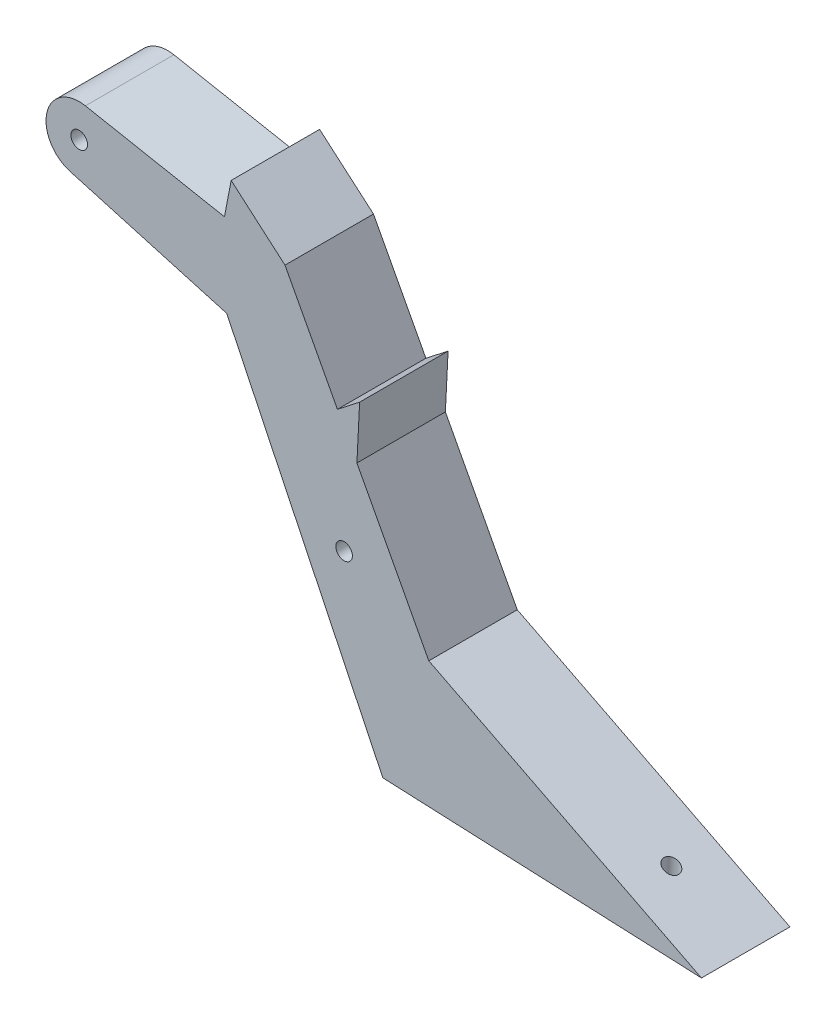
ISO-10303-21;
HEADER;
FILE_DESCRIPTION(('STEP AP214'),'2;1');
FILE_NAME('part.step','',(''),(''),'','','');
FILE_SCHEMA(('AUTOMOTIVE_DESIGN { 1 0 10303 214 1 1 1 1 }'));
ENDSEC;
DATA;
#1=APPLICATION_CONTEXT('core data for automotive mechanical design processes');
#2=APPLICATION_PROTOCOL_DEFINITION('international standard','automotive_design',2000,#1);
#3=PRODUCT_CONTEXT('',#1,'mechanical');
#4=PRODUCT('Part','Part','',(#3));
#5=PRODUCT_RELATED_PRODUCT_CATEGORY('part','',(#4));
#6=PRODUCT_DEFINITION_FORMATION('','',#4);
#7=PRODUCT_DEFINITION_CONTEXT('part definition',#1,'design');
#8=PRODUCT_DEFINITION('design','',#6,#7);
#9=PRODUCT_DEFINITION_SHAPE('','',#8);
#10=(LENGTH_UNIT() NAMED_UNIT(*) SI_UNIT(.MILLI.,.METRE.));
#11=(NAMED_UNIT(*) PLANE_ANGLE_UNIT() SI_UNIT($,.RADIAN.));
#12=(NAMED_UNIT(*) SI_UNIT($,.STERADIAN.) SOLID_ANGLE_UNIT());
#13=UNCERTAINTY_MEASURE_WITH_UNIT(LENGTH_MEASURE(1.E-05),#10,'distance_accuracy_value','');
#14=(GEOMETRIC_REPRESENTATION_CONTEXT(3) GLOBAL_UNCERTAINTY_ASSIGNED_CONTEXT((#13)) GLOBAL_UNIT_ASSIGNED_CONTEXT((#10,
#11,#12)) REPRESENTATION_CONTEXT('',''));
#15=CARTESIAN_POINT('',(0.,0.,0.));
#16=DIRECTION('',(0.,0.,1.));
#17=DIRECTION('',(1.,0.,0.));
#18=AXIS2_PLACEMENT_3D('',#15,#16,#17);
#19=CARTESIAN_POINT('',(37.2209746860255,-1.00537022475931,16.));
#20=DIRECTION('',(-0.883195821558928,-0.469004414457743,0.));
#21=DIRECTION('',(0.469004414457743,-0.883195821558928,0.));
#22=AXIS2_PLACEMENT_3D('',#19,#20,#21);
#23=PLANE('',#22);
#24=DIRECTION('',(-0.469004414457743,0.883195821558928,0.));
#25=VECTOR('',#24,1.);
#26=CARTESIAN_POINT('',(37.2209746860255,-1.00537022475931,16.));
#27=LINE('',#26,#25);
#28=CARTESIAN_POINT('',(46.6985747444453,-18.852913898055,16.));
#29=VERTEX_POINT('',#28);
#30=CARTESIAN_POINT('',(37.2209746860255,-1.00537022475931,16.));
#31=VERTEX_POINT('',#30);
#32=EDGE_CURVE('E245',#29,#31,#27,.T.);
#33=ORIENTED_EDGE('',*,*,#32,.F.);
#34=DIRECTION('',(0.,0.,1.));
#35=VECTOR('',#34,1.);
#36=CARTESIAN_POINT('',(46.6985747444453,-18.8529138980549,0.));
#37=LINE('',#36,#35);
#38=CARTESIAN_POINT('',(46.6985747444453,-18.8529138980549,0.));
#39=VERTEX_POINT('',#38);
#40=EDGE_CURVE('E281',#39,#29,#37,.T.);
#41=ORIENTED_EDGE('',*,*,#40,.F.);
#42=DIRECTION('',(-0.469004414457743,0.883195821558928,0.));
#43=VECTOR('',#42,1.);
#44=CARTESIAN_POINT('',(37.2209746860255,-1.00537022475931,0.));
#45=LINE('',#44,#43);
#46=CARTESIAN_POINT('',(37.2209746860255,-1.00537022475931,0.));
#47=VERTEX_POINT('',#46);
#48=EDGE_CURVE('E162',#39,#47,#45,.T.);
#49=ORIENTED_EDGE('',*,*,#48,.T.);
#50=DIRECTION('',(0.,0.,-1.));
#51=VECTOR('',#50,1.);
#52=CARTESIAN_POINT('',(37.2209746860255,-1.00537022475931,16.));
#53=LINE('',#52,#51);
#54=EDGE_CURVE('E184',#31,#47,#53,.T.);
#55=ORIENTED_EDGE('',*,*,#54,.F.);
#56=EDGE_LOOP('',(#33,#41,#49,#55));
#57=FACE_BOUND('',#56,.T.);
#58=ADVANCED_FACE('F44',(#57),#23,.F.);
#59=CARTESIAN_POINT('',(0.,0.,16.));
#60=DIRECTION('',(0.,0.,1.));
#61=DIRECTION('',(1.,0.,0.));
#62=AXIS2_PLACEMENT_3D('',#59,#60,#61);
#63=PLANE('',#62);
#64=CARTESIAN_POINT('',(47.9111175536976,-40.4615263218011,16.));
#65=DIRECTION('',(0.,0.,1.));
#66=DIRECTION('',(1.,0.,0.));
#67=AXIS2_PLACEMENT_3D('',#64,#65,#66);
#68=CIRCLE('',#67,1.5);
#69=CARTESIAN_POINT('',(49.4111175536976,-40.4615263218011,16.));
#70=VERTEX_POINT('',#69);
#71=EDGE_CURVE('E205',#70,#70,#68,.T.);
#72=ORIENTED_EDGE('',*,*,#71,.F.);
#73=EDGE_LOOP('',(#72));
#74=FACE_BOUND('',#73,.T.);
#75=DIRECTION('',(-0.433829895516032,0.900994795632333,0.));
#76=VECTOR('',#75,1.);
#77=CARTESIAN_POINT('',(26.6827335987823,-13.8357209188859,16.));
#78=LINE('',#77,#76);
#79=CARTESIAN_POINT('',(54.9111175536976,-72.4615263218011,16.));
#80=VERTEX_POINT('',#79);
#81=CARTESIAN_POINT('',(26.6827335987823,-13.8357209188859,16.));
#82=VERTEX_POINT('',#81);
#83=EDGE_CURVE('E211',#80,#82,#78,.T.);
#84=ORIENTED_EDGE('',*,*,#83,.F.);
#85=DIRECTION('',(0.999031203229182,-0.0440074422621161,0.));
#86=VECTOR('',#85,1.);
#87=CARTESIAN_POINT('',(112.538061605381,-75.,16.));
#88=LINE('',#87,#86);
#89=CARTESIAN_POINT('',(112.538061605381,-75.,16.));
#90=VERTEX_POINT('',#89);
#91=EDGE_CURVE('E174',#80,#90,#88,.T.);
#92=ORIENTED_EDGE('',*,*,#91,.T.);
#93=DIRECTION('',(-0.891770927429079,0.452487141245228,0.));
#94=VECTOR('',#93,1.);
#95=CARTESIAN_POINT('',(63.2279842048484,-49.979924472451,16.));
#96=LINE('',#95,#94);
#97=CARTESIAN_POINT('',(63.2279842048484,-49.979924472451,16.));
#98=VERTEX_POINT('',#97);
#99=EDGE_CURVE('E243',#90,#98,#96,.T.);
#100=ORIENTED_EDGE('',*,*,#99,.T.);
#101=CARTESIAN_POINT('',(50.2244794454369,-25.4926473486051,16.));
#102=VERTEX_POINT('',#101);
#103=EDGE_CURVE('E246',#98,#102,#27,.T.);
#104=ORIENTED_EDGE('',*,*,#103,.T.);
#105=DIRECTION('',(0.049916707520047,0.998753384129615,0.));
#106=VECTOR('',#105,1.);
#107=CARTESIAN_POINT('',(50.7127196250252,-15.7237431908936,16.));
#108=LINE('',#107,#106);
#109=CARTESIAN_POINT('',(50.7127196250252,-15.7237431908936,16.));
#110=VERTEX_POINT('',#109);
#111=EDGE_CURVE('E141',#102,#110,#108,.T.);
#112=ORIENTED_EDGE('',*,*,#111,.T.);
#113=DIRECTION('',(-0.788679715737918,-0.614804282665269,0.));
#114=VECTOR('',#113,1.);
#115=CARTESIAN_POINT('',(46.6985747444453,-18.8529138980549,16.));
#116=LINE('',#115,#114);
#117=EDGE_CURVE('E60',#110,#29,#116,.T.);
#118=ORIENTED_EDGE('',*,*,#117,.T.);
#119=ORIENTED_EDGE('',*,*,#32,.T.);
#120=DIRECTION('',(0.75751334061122,-0.652819683217372,0.));
#121=VECTOR('',#120,1.);
#122=CARTESIAN_POINT('',(37.2209746860255,-1.00537022475931,16.));
#123=LINE('',#122,#121);
#124=CARTESIAN_POINT('',(27.4801375180719,7.38921491762844,16.));
#125=VERTEX_POINT('',#124);
#126=EDGE_CURVE('E195',#125,#31,#123,.T.);
#127=ORIENTED_EDGE('',*,*,#126,.F.);
#128=DIRECTION('',(0.187730049160435,0.982220661889283,0.));
#129=VECTOR('',#128,1.);
#130=CARTESIAN_POINT('',(27.4801375180719,7.38921491762844,16.));
#131=LINE('',#130,#129);
#132=CARTESIAN_POINT('',(26.2755325268767,1.08661223330399,16.));
#133=VERTEX_POINT('',#132);
#134=EDGE_CURVE('E201',#133,#125,#131,.T.);
#135=ORIENTED_EDGE('',*,*,#134,.F.);
#136=DIRECTION('',(-0.982220661889283,0.187730049160435,0.));
#137=VECTOR('',#136,1.);
#138=CARTESIAN_POINT('',(1.12638029496261,5.8933239713357,16.));
#139=LINE('',#138,#137);
#140=CARTESIAN_POINT('',(1.12638029496261,5.8933239713357,16.));
#141=VERTEX_POINT('',#140);
#142=EDGE_CURVE('E68',#133,#141,#139,.T.);
#143=ORIENTED_EDGE('',*,*,#142,.T.);
#144=CARTESIAN_POINT('',(0.,0.,16.));
#145=DIRECTION('',(0.,0.,1.));
#146=DIRECTION('',(1.,0.,0.));
#147=AXIS2_PLACEMENT_3D('',#144,#145,#146);
#148=CIRCLE('',#147,6.);
#149=CARTESIAN_POINT('',(-1.6430506475302,-5.77064853977875,16.));
#150=VERTEX_POINT('',#149);
#151=EDGE_CURVE('E249',#141,#150,#148,.T.);
#152=ORIENTED_EDGE('',*,*,#151,.T.);
#153=DIRECTION('',(0.961774756629791,-0.273841774588366,0.));
#154=VECTOR('',#153,1.);
#155=CARTESIAN_POINT('',(26.6827335987823,-13.8357209188859,16.));
#156=LINE('',#155,#154);
#157=EDGE_CURVE('E178',#150,#82,#156,.T.);
#158=ORIENTED_EDGE('',*,*,#157,.T.);
#159=EDGE_LOOP('',(#84,#92,#100,#104,#112,#118,#119,#127,#135,#143,#152,#158));
#160=FACE_BOUND('',#159,.T.);
#161=CARTESIAN_POINT('',(0.,0.,16.));
#162=DIRECTION('',(0.,0.,1.));
#163=DIRECTION('',(1.,0.,0.));
#164=AXIS2_PLACEMENT_3D('',#161,#162,#163);
#165=CIRCLE('',#164,1.5);
#166=CARTESIAN_POINT('',(1.5,0.,16.));
#167=VERTEX_POINT('',#166);
#168=EDGE_CURVE('E236',#167,#167,#165,.T.);
#169=ORIENTED_EDGE('',*,*,#168,.F.);
#170=EDGE_LOOP('',(#169));
#171=FACE_BOUND('',#170,.T.);
#172=ADVANCED_FACE('F274',(#74,#160,#171),#63,.T.);
#173=CARTESIAN_POINT('',(0.,0.,0.));
#174=DIRECTION('',(0.,0.,1.));
#175=DIRECTION('',(1.,0.,0.));
#176=AXIS2_PLACEMENT_3D('',#173,#174,#175);
#177=PLANE('',#176);
#178=CARTESIAN_POINT('',(47.9111175536976,-40.4615263218011,0.));
#179=DIRECTION('',(0.,0.,-1.));
#180=DIRECTION('',(-1.,0.,0.));
#181=AXIS2_PLACEMENT_3D('',#178,#179,#180);
#182=CIRCLE('',#181,1.5);
#183=CARTESIAN_POINT('',(46.4111175536976,-40.4615263218011,0.));
#184=VERTEX_POINT('',#183);
#185=EDGE_CURVE('E279',#184,#184,#182,.T.);
#186=ORIENTED_EDGE('',*,*,#185,.F.);
#187=EDGE_LOOP('',(#186));
#188=FACE_BOUND('',#187,.T.);
#189=DIRECTION('',(0.999031203229182,-0.0440074422621161,0.));
#190=VECTOR('',#189,1.);
#191=CARTESIAN_POINT('',(112.538061605381,-75.,0.));
#192=LINE('',#191,#190);
#193=CARTESIAN_POINT('',(54.9111175536976,-72.4615263218011,0.));
#194=VERTEX_POINT('',#193);
#195=CARTESIAN_POINT('',(112.538061605381,-75.,0.));
#196=VERTEX_POINT('',#195);
#197=EDGE_CURVE('E239',#194,#196,#192,.T.);
#198=ORIENTED_EDGE('',*,*,#197,.F.);
#199=DIRECTION('',(-0.433829895516032,0.900994795632333,0.));
#200=VECTOR('',#199,1.);
#201=CARTESIAN_POINT('',(16.2527340455594,7.82570770332413,0.));
#202=LINE('',#201,#200);
#203=CARTESIAN_POINT('',(26.6827335987823,-13.8357209188859,0.));
#204=VERTEX_POINT('',#203);
#205=EDGE_CURVE('E217',#194,#204,#202,.T.);
#206=ORIENTED_EDGE('',*,*,#205,.T.);
#207=DIRECTION('',(0.961774756629791,-0.273841774588366,0.));
#208=VECTOR('',#207,1.);
#209=CARTESIAN_POINT('',(26.6827335987823,-13.8357209188859,0.));
#210=LINE('',#209,#208);
#211=CARTESIAN_POINT('',(-1.6430506475302,-5.77064853977875,0.));
#212=VERTEX_POINT('',#211);
#213=EDGE_CURVE('E171',#212,#204,#210,.T.);
#214=ORIENTED_EDGE('',*,*,#213,.F.);
#215=CARTESIAN_POINT('',(0.,0.,0.));
#216=DIRECTION('',(0.,0.,1.));
#217=DIRECTION('',(1.,0.,0.));
#218=AXIS2_PLACEMENT_3D('',#215,#216,#217);
#219=CIRCLE('',#218,6.);
#220=CARTESIAN_POINT('',(1.12638029496261,5.8933239713357,0.));
#221=VERTEX_POINT('',#220);
#222=EDGE_CURVE('E164',#221,#212,#219,.T.);
#223=ORIENTED_EDGE('',*,*,#222,.F.);
#224=DIRECTION('',(-0.982220661889283,0.187730049160435,0.));
#225=VECTOR('',#224,1.);
#226=CARTESIAN_POINT('',(1.12638029496261,5.8933239713357,0.));
#227=LINE('',#226,#225);
#228=CARTESIAN_POINT('',(26.2755325268767,1.08661223330399,0.));
#229=VERTEX_POINT('',#228);
#230=EDGE_CURVE('E161',#229,#221,#227,.T.);
#231=ORIENTED_EDGE('',*,*,#230,.F.);
#232=DIRECTION('',(0.187730049160435,0.982220661889283,0.));
#233=VECTOR('',#232,1.);
#234=CARTESIAN_POINT('',(27.4801375180719,7.38921491762844,0.));
#235=LINE('',#234,#233);
#236=CARTESIAN_POINT('',(27.4801375180719,7.38921491762844,0.));
#237=VERTEX_POINT('',#236);
#238=EDGE_CURVE('E200',#229,#237,#235,.T.);
#239=ORIENTED_EDGE('',*,*,#238,.T.);
#240=DIRECTION('',(0.75751334061122,-0.652819683217372,0.));
#241=VECTOR('',#240,1.);
#242=CARTESIAN_POINT('',(37.2209746860255,-1.00537022475931,0.));
#243=LINE('',#242,#241);
#244=EDGE_CURVE('E193',#237,#47,#243,.T.);
#245=ORIENTED_EDGE('',*,*,#244,.T.);
#246=ORIENTED_EDGE('',*,*,#48,.F.);
#247=DIRECTION('',(-0.788679715737918,-0.614804282665269,0.));
#248=VECTOR('',#247,1.);
#249=CARTESIAN_POINT('',(46.6985747444453,-18.8529138980549,0.));
#250=LINE('',#249,#248);
#251=CARTESIAN_POINT('',(50.7127196250252,-15.7237431908936,0.));
#252=VERTEX_POINT('',#251);
#253=EDGE_CURVE('E147',#252,#39,#250,.T.);
#254=ORIENTED_EDGE('',*,*,#253,.F.);
#255=DIRECTION('',(0.049916707520047,0.998753384129615,0.));
#256=VECTOR('',#255,1.);
#257=CARTESIAN_POINT('',(50.7127196250252,-15.7237431908936,0.));
#258=LINE('',#257,#256);
#259=CARTESIAN_POINT('',(50.2244794454369,-25.4926473486051,0.));
#260=VERTEX_POINT('',#259);
#261=EDGE_CURVE('E139',#260,#252,#258,.T.);
#262=ORIENTED_EDGE('',*,*,#261,.F.);
#263=CARTESIAN_POINT('',(63.2279842048484,-49.979924472451,0.));
#264=VERTEX_POINT('',#263);
#265=EDGE_CURVE('E155',#264,#260,#45,.T.);
#266=ORIENTED_EDGE('',*,*,#265,.F.);
#267=DIRECTION('',(-0.891770927429079,0.452487141245228,0.));
#268=VECTOR('',#267,1.);
#269=CARTESIAN_POINT('',(63.2279842048484,-49.979924472451,0.));
#270=LINE('',#269,#268);
#271=EDGE_CURVE('E166',#196,#264,#270,.T.);
#272=ORIENTED_EDGE('',*,*,#271,.F.);
#273=EDGE_LOOP('',(#198,#206,#214,#223,#231,#239,#245,#246,#254,#262,#266,#272));
#274=FACE_BOUND('',#273,.T.);
#275=CARTESIAN_POINT('',(0.,0.,0.));
#276=DIRECTION('',(0.,0.,1.));
#277=DIRECTION('',(1.,0.,0.));
#278=AXIS2_PLACEMENT_3D('',#275,#276,#277);
#279=CIRCLE('',#278,1.5);
#280=CARTESIAN_POINT('',(1.5,0.,0.));
#281=VERTEX_POINT('',#280);
#282=EDGE_CURVE('E232',#281,#281,#279,.T.);
#283=ORIENTED_EDGE('',*,*,#282,.T.);
#284=EDGE_LOOP('',(#283));
#285=FACE_BOUND('',#284,.T.);
#286=ADVANCED_FACE('F152',(#188,#274,#285),#177,.F.);
#287=CARTESIAN_POINT('',(112.538061605381,-75.,16.));
#288=DIRECTION('',(0.0440074422621161,0.999031203229182,0.));
#289=DIRECTION('',(-0.999031203229182,0.0440074422621161,0.));
#290=AXIS2_PLACEMENT_3D('',#287,#288,#289);
#291=PLANE('',#290);
#292=CARTESIAN_POINT('',(98.8217695266379,-74.3957957171363,8.));
#293=DIRECTION('',(-0.0440074422621161,-0.999031203229182,0.));
#294=DIRECTION('',(0.999031203229182,-0.0440074422621161,0.));
#295=AXIS2_PLACEMENT_3D('',#292,#293,#294);
#296=CIRCLE('',#295,1.35000000000001);
#297=CARTESIAN_POINT('',(100.170461650997,-74.4552057641901,8.));
#298=VERTEX_POINT('',#297);
#299=EDGE_CURVE('E221',#298,#298,#296,.T.);
#300=ORIENTED_EDGE('',*,*,#299,.F.);
#301=EDGE_LOOP('',(#300));
#302=FACE_BOUND('',#301,.T.);
#303=CARTESIAN_POINT('',(80.8392078685126,-73.6036617564182,8.));
#304=DIRECTION('',(-0.0440074422621161,-0.999031203229182,0.));
#305=DIRECTION('',(0.999031203229182,-0.0440074422621161,0.));
#306=AXIS2_PLACEMENT_3D('',#303,#304,#305);
#307=CIRCLE('',#306,1.35000000000001);
#308=CARTESIAN_POINT('',(82.1878999928721,-73.6630718034721,8.));
#309=VERTEX_POINT('',#308);
#310=EDGE_CURVE('E220',#309,#309,#307,.T.);
#311=ORIENTED_EDGE('',*,*,#310,.F.);
#312=EDGE_LOOP('',(#311));
#313=FACE_BOUND('',#312,.T.);
#314=CARTESIAN_POINT('',(62.8566462103874,-72.8115277957001,8.));
#315=DIRECTION('',(-0.0440074422621161,-0.999031203229182,0.));
#316=DIRECTION('',(0.999031203229182,-0.0440074422621161,0.));
#317=AXIS2_PLACEMENT_3D('',#314,#315,#316);
#318=CIRCLE('',#317,1.35000000000001);
#319=CARTESIAN_POINT('',(64.2053383347468,-72.870937842754,8.));
#320=VERTEX_POINT('',#319);
#321=EDGE_CURVE('E233',#320,#320,#318,.T.);
#322=ORIENTED_EDGE('',*,*,#321,.F.);
#323=EDGE_LOOP('',(#322));
#324=FACE_BOUND('',#323,.T.);
#325=ORIENTED_EDGE('',*,*,#91,.F.);
#326=DIRECTION('',(0.,0.,1.));
#327=VECTOR('',#326,1.);
#328=CARTESIAN_POINT('',(54.9111175536976,-72.4615263218011,-17.));
#329=LINE('',#328,#327);
#330=EDGE_CURVE('E215',#194,#80,#329,.T.);
#331=ORIENTED_EDGE('',*,*,#330,.F.);
#332=ORIENTED_EDGE('',*,*,#197,.T.);
#333=DIRECTION('',(0.,0.,-1.));
#334=VECTOR('',#333,1.);
#335=CARTESIAN_POINT('',(112.538061605381,-75.,16.));
#336=LINE('',#335,#334);
#337=EDGE_CURVE('E13',#90,#196,#336,.T.);
#338=ORIENTED_EDGE('',*,*,#337,.F.);
#339=EDGE_LOOP('',(#325,#331,#332,#338));
#340=FACE_BOUND('',#339,.T.);
#341=ADVANCED_FACE('F46',(#302,#313,#324,#340),#291,.F.);
#342=CARTESIAN_POINT('',(63.2279842048484,-49.979924472451,16.));
#343=DIRECTION('',(-0.452487141245229,-0.89177092742908,0.));
#344=DIRECTION('',(0.891770927429079,-0.452487141245228,0.));
#345=AXIS2_PLACEMENT_3D('',#342,#343,#344);
#346=PLANE('',#345);
#347=CARTESIAN_POINT('',(99.0956086321407,-68.1792605812789,8.));
#348=DIRECTION('',(-0.452487141245229,-0.89177092742908,0.));
#349=DIRECTION('',(0.891770927429079,-0.452487141245228,0.));
#350=AXIS2_PLACEMENT_3D('',#347,#348,#349);
#351=ELLIPSE('',#350,1.48218124282779,1.35000000000001);
#352=CARTESIAN_POINT('',(100.417374773675,-68.8499285346534,8.));
#353=VERTEX_POINT('',#352);
#354=EDGE_CURVE('E48',#353,#353,#351,.T.);
#355=ORIENTED_EDGE('',*,*,#354,.T.);
#356=EDGE_LOOP('',(#355));
#357=FACE_BOUND('',#356,.T.);
#358=ORIENTED_EDGE('',*,*,#271,.T.);
#359=DIRECTION('',(0.,0.,-1.));
#360=VECTOR('',#359,1.);
#361=CARTESIAN_POINT('',(63.2279842048484,-49.979924472451,16.));
#362=LINE('',#361,#360);
#363=EDGE_CURVE('E53',#98,#264,#362,.T.);
#364=ORIENTED_EDGE('',*,*,#363,.F.);
#365=ORIENTED_EDGE('',*,*,#99,.F.);
#366=ORIENTED_EDGE('',*,*,#337,.T.);
#367=EDGE_LOOP('',(#358,#364,#365,#366));
#368=FACE_BOUND('',#367,.T.);
#369=ADVANCED_FACE('F256',(#357,#368),#346,.F.);
#370=ORIENTED_EDGE('',*,*,#265,.T.);
#371=DIRECTION('',(0.,0.,1.));
#372=VECTOR('',#371,1.);
#373=CARTESIAN_POINT('',(50.2244794454369,-25.4926473486051,0.));
#374=LINE('',#373,#372);
#375=EDGE_CURVE('E136',#260,#102,#374,.T.);
#376=ORIENTED_EDGE('',*,*,#375,.T.);
#377=ORIENTED_EDGE('',*,*,#103,.F.);
#378=ORIENTED_EDGE('',*,*,#363,.T.);
#379=EDGE_LOOP('',(#370,#376,#377,#378));
#380=FACE_BOUND('',#379,.T.);
#381=ADVANCED_FACE('F159',(#380),#23,.F.);
#382=CARTESIAN_POINT('',(1.12638029496261,5.8933239713357,16.));
#383=DIRECTION('',(-0.187730049160435,-0.982220661889283,0.));
#384=DIRECTION('',(0.982220661889283,-0.187730049160435,0.));
#385=AXIS2_PLACEMENT_3D('',#382,#383,#384);
#386=PLANE('',#385);
#387=ORIENTED_EDGE('',*,*,#142,.F.);
#388=DIRECTION('',(0.,0.,-1.));
#389=VECTOR('',#388,1.);
#390=CARTESIAN_POINT('',(26.2755325268767,1.08661223330399,16.));
#391=LINE('',#390,#389);
#392=EDGE_CURVE('E212',#133,#229,#391,.T.);
#393=ORIENTED_EDGE('',*,*,#392,.T.);
#394=ORIENTED_EDGE('',*,*,#230,.T.);
#395=DIRECTION('',(0.,0.,-1.));
#396=VECTOR('',#395,1.);
#397=CARTESIAN_POINT('',(1.12638029496261,5.8933239713357,16.));
#398=LINE('',#397,#396);
#399=EDGE_CURVE('E181',#141,#221,#398,.T.);
#400=ORIENTED_EDGE('',*,*,#399,.F.);
#401=EDGE_LOOP('',(#387,#393,#394,#400));
#402=FACE_BOUND('',#401,.T.);
#403=ADVANCED_FACE('F269',(#402),#386,.F.);
#404=CARTESIAN_POINT('',(0.,0.,16.));
#405=DIRECTION('',(0.,0.,-1.));
#406=DIRECTION('',(-1.,0.,0.));
#407=AXIS2_PLACEMENT_3D('',#404,#405,#406);
#408=CYLINDRICAL_SURFACE('',#407,6.);
#409=ORIENTED_EDGE('',*,*,#222,.T.);
#410=DIRECTION('',(0.,0.,-1.));
#411=VECTOR('',#410,1.);
#412=CARTESIAN_POINT('',(-1.6430506475302,-5.77064853977875,16.));
#413=LINE('',#412,#411);
#414=EDGE_CURVE('E177',#150,#212,#413,.T.);
#415=ORIENTED_EDGE('',*,*,#414,.F.);
#416=ORIENTED_EDGE('',*,*,#151,.F.);
#417=ORIENTED_EDGE('',*,*,#399,.T.);
#418=EDGE_LOOP('',(#409,#415,#416,#417));
#419=FACE_BOUND('',#418,.T.);
#420=ADVANCED_FACE('F268',(#419),#408,.T.);
#421=CARTESIAN_POINT('',(26.6827335987823,-13.8357209188859,16.));
#422=DIRECTION('',(0.273841774588366,0.961774756629791,0.));
#423=DIRECTION('',(-0.961774756629791,0.273841774588366,0.));
#424=AXIS2_PLACEMENT_3D('',#421,#422,#423);
#425=PLANE('',#424);
#426=ORIENTED_EDGE('',*,*,#213,.T.);
#427=DIRECTION('',(0.,0.,-1.));
#428=VECTOR('',#427,1.);
#429=CARTESIAN_POINT('',(26.6827335987823,-13.8357209188859,16.));
#430=LINE('',#429,#428);
#431=EDGE_CURVE('E175',#82,#204,#430,.T.);
#432=ORIENTED_EDGE('',*,*,#431,.F.);
#433=ORIENTED_EDGE('',*,*,#157,.F.);
#434=ORIENTED_EDGE('',*,*,#414,.T.);
#435=EDGE_LOOP('',(#426,#432,#433,#434));
#436=FACE_BOUND('',#435,.T.);
#437=ADVANCED_FACE('F263',(#436),#425,.F.);
#438=CARTESIAN_POINT('',(0.,0.,16.));
#439=DIRECTION('',(0.,0.,-1.));
#440=DIRECTION('',(-1.,0.,0.));
#441=AXIS2_PLACEMENT_3D('',#438,#439,#440);
#442=CYLINDRICAL_SURFACE('',#441,1.5);
#443=ORIENTED_EDGE('',*,*,#168,.T.);
#444=EDGE_LOOP('',(#443));
#445=FACE_BOUND('',#444,.T.);
#446=ORIENTED_EDGE('',*,*,#282,.F.);
#447=EDGE_LOOP('',(#446));
#448=FACE_BOUND('',#447,.T.);
#449=ADVANCED_FACE('F340',(#445,#448),#442,.F.);
#450=CARTESIAN_POINT('',(63.2967206330085,-62.8212157634083,8.));
#451=DIRECTION('',(-0.0440074422621161,-0.999031203229182,0.));
#452=DIRECTION('',(0.999031203229182,-0.0440074422621161,0.));
#453=AXIS2_PLACEMENT_3D('',#450,#451,#452);
#454=CYLINDRICAL_SURFACE('',#453,1.35000000000001);
#455=CARTESIAN_POINT('',(63.2967206330085,-62.8212157634083,8.));
#456=DIRECTION('',(-0.0440074422621161,-0.999031203229182,0.));
#457=DIRECTION('',(0.999031203229182,-0.0440074422621161,0.));
#458=AXIS2_PLACEMENT_3D('',#455,#456,#457);
#459=CIRCLE('',#458,1.35000000000001);
#460=CARTESIAN_POINT('',(64.6454127573679,-62.8806258104621,8.));
#461=VERTEX_POINT('',#460);
#462=EDGE_CURVE('E229',#461,#461,#459,.T.);
#463=ORIENTED_EDGE('',*,*,#462,.F.);
#464=EDGE_LOOP('',(#463));
#465=FACE_BOUND('',#464,.T.);
#466=ORIENTED_EDGE('',*,*,#321,.T.);
#467=EDGE_LOOP('',(#466));
#468=FACE_BOUND('',#467,.T.);
#469=ADVANCED_FACE('F328',(#465,#468),#454,.F.);
#470=CARTESIAN_POINT('',(63.2967206330085,-62.8212157634083,8.));
#471=DIRECTION('',(-0.0440074422621161,-0.999031203229182,0.));
#472=DIRECTION('',(0.999031203229182,-0.0440074422621161,0.));
#473=AXIS2_PLACEMENT_3D('',#470,#471,#472);
#474=PLANE('',#473);
#475=ORIENTED_EDGE('',*,*,#462,.T.);
#476=EDGE_LOOP('',(#475));
#477=FACE_BOUND('',#476,.T.);
#478=ADVANCED_FACE('F318',(#477),#474,.T.);
#479=CARTESIAN_POINT('',(99.2618439492591,-64.4054836848445,8.));
#480=DIRECTION('',(-0.0440074422621161,-0.999031203229182,0.));
#481=DIRECTION('',(0.999031203229182,-0.0440074422621161,0.));
#482=AXIS2_PLACEMENT_3D('',#479,#480,#481);
#483=CYLINDRICAL_SURFACE('',#482,1.35000000000001);
#484=ORIENTED_EDGE('',*,*,#299,.T.);
#485=EDGE_LOOP('',(#484));
#486=FACE_BOUND('',#485,.T.);
#487=ORIENTED_EDGE('',*,*,#354,.F.);
#488=EDGE_LOOP('',(#487));
#489=FACE_BOUND('',#488,.T.);
#490=ADVANCED_FACE('F315',(#486,#489),#483,.F.);
#491=CARTESIAN_POINT('',(81.2792822911338,-63.6133497241264,8.));
#492=DIRECTION('',(-0.0440074422621161,-0.999031203229182,0.));
#493=DIRECTION('',(0.999031203229182,-0.0440074422621161,0.));
#494=AXIS2_PLACEMENT_3D('',#491,#492,#493);
#495=CYLINDRICAL_SURFACE('',#494,1.35000000000001);
#496=CARTESIAN_POINT('',(81.2792822911338,-63.6133497241264,8.));
#497=DIRECTION('',(-0.0440074422621161,-0.999031203229182,0.));
#498=DIRECTION('',(0.999031203229182,-0.0440074422621161,0.));
#499=AXIS2_PLACEMENT_3D('',#496,#497,#498);
#500=CIRCLE('',#499,1.35000000000001);
#501=CARTESIAN_POINT('',(82.6279744154932,-63.6727597711802,8.));
#502=VERTEX_POINT('',#501);
#503=EDGE_CURVE('E224',#502,#502,#500,.T.);
#504=ORIENTED_EDGE('',*,*,#503,.F.);
#505=EDGE_LOOP('',(#504));
#506=FACE_BOUND('',#505,.T.);
#507=ORIENTED_EDGE('',*,*,#310,.T.);
#508=EDGE_LOOP('',(#507));
#509=FACE_BOUND('',#508,.T.);
#510=ADVANCED_FACE('F317',(#506,#509),#495,.F.);
#511=CARTESIAN_POINT('',(81.2792822911338,-63.6133497241264,8.));
#512=DIRECTION('',(-0.0440074422621161,-0.999031203229182,0.));
#513=DIRECTION('',(0.999031203229182,-0.0440074422621161,0.));
#514=AXIS2_PLACEMENT_3D('',#511,#512,#513);
#515=PLANE('',#514);
#516=ORIENTED_EDGE('',*,*,#503,.T.);
#517=EDGE_LOOP('',(#516));
#518=FACE_BOUND('',#517,.T.);
#519=ADVANCED_FACE('F325',(#518),#515,.T.);
#520=CARTESIAN_POINT('',(26.6827335987823,-13.8357209188859,-17.));
#521=DIRECTION('',(0.900994795632333,0.433829895516032,0.));
#522=DIRECTION('',(-0.433829895516032,0.900994795632333,0.));
#523=AXIS2_PLACEMENT_3D('',#520,#521,#522);
#524=PLANE('',#523);
#525=ORIENTED_EDGE('',*,*,#330,.T.);
#526=ORIENTED_EDGE('',*,*,#83,.T.);
#527=ORIENTED_EDGE('',*,*,#431,.T.);
#528=ORIENTED_EDGE('',*,*,#205,.F.);
#529=EDGE_LOOP('',(#525,#526,#527,#528));
#530=FACE_BOUND('',#529,.T.);
#531=ADVANCED_FACE('F333',(#530),#524,.F.);
#532=CARTESIAN_POINT('',(37.2209746860255,-1.00537022475931,16.));
#533=DIRECTION('',(0.652819683217372,0.75751334061122,0.));
#534=DIRECTION('',(-0.75751334061122,0.652819683217372,0.));
#535=AXIS2_PLACEMENT_3D('',#532,#533,#534);
#536=PLANE('',#535);
#537=ORIENTED_EDGE('',*,*,#244,.F.);
#538=DIRECTION('',(0.,0.,-1.));
#539=VECTOR('',#538,1.);
#540=CARTESIAN_POINT('',(27.4801375180719,7.38921491762844,16.));
#541=LINE('',#540,#539);
#542=EDGE_CURVE('E209',#125,#237,#541,.T.);
#543=ORIENTED_EDGE('',*,*,#542,.F.);
#544=ORIENTED_EDGE('',*,*,#126,.T.);
#545=ORIENTED_EDGE('',*,*,#54,.T.);
#546=EDGE_LOOP('',(#537,#543,#544,#545));
#547=FACE_BOUND('',#546,.T.);
#548=ADVANCED_FACE('F192',(#547),#536,.T.);
#549=CARTESIAN_POINT('',(27.4801375180719,7.38921491762844,16.));
#550=DIRECTION('',(-0.982220661889283,0.187730049160435,0.));
#551=DIRECTION('',(-0.187730049160435,-0.982220661889283,0.));
#552=AXIS2_PLACEMENT_3D('',#549,#550,#551);
#553=PLANE('',#552);
#554=ORIENTED_EDGE('',*,*,#238,.F.);
#555=ORIENTED_EDGE('',*,*,#392,.F.);
#556=ORIENTED_EDGE('',*,*,#134,.T.);
#557=ORIENTED_EDGE('',*,*,#542,.T.);
#558=EDGE_LOOP('',(#554,#555,#556,#557));
#559=FACE_BOUND('',#558,.T.);
#560=ADVANCED_FACE('F272',(#559),#553,.T.);
#561=CARTESIAN_POINT('',(47.9111175536976,-40.4615263218011,48.));
#562=DIRECTION('',(0.,0.,-1.));
#563=DIRECTION('',(-1.,0.,0.));
#564=AXIS2_PLACEMENT_3D('',#561,#562,#563);
#565=CYLINDRICAL_SURFACE('',#564,1.5);
#566=ORIENTED_EDGE('',*,*,#71,.T.);
#567=EDGE_LOOP('',(#566));
#568=FACE_BOUND('',#567,.T.);
#569=ORIENTED_EDGE('',*,*,#185,.T.);
#570=EDGE_LOOP('',(#569));
#571=FACE_BOUND('',#570,.T.);
#572=ADVANCED_FACE('F438',(#568,#571),#565,.F.);
#573=CARTESIAN_POINT('',(46.6985747444453,-18.8529138980549,0.));
#574=DIRECTION('',(-0.614804282665269,0.788679715737918,0.));
#575=DIRECTION('',(-0.788679715737918,-0.614804282665269,0.));
#576=AXIS2_PLACEMENT_3D('',#573,#574,#575);
#577=PLANE('',#576);
#578=ORIENTED_EDGE('',*,*,#117,.F.);
#579=DIRECTION('',(0.,0.,1.));
#580=VECTOR('',#579,1.);
#581=CARTESIAN_POINT('',(50.7127196250252,-15.7237431908936,0.));
#582=LINE('',#581,#580);
#583=EDGE_CURVE('E146',#252,#110,#582,.T.);
#584=ORIENTED_EDGE('',*,*,#583,.F.);
#585=ORIENTED_EDGE('',*,*,#253,.T.);
#586=ORIENTED_EDGE('',*,*,#40,.T.);
#587=EDGE_LOOP('',(#578,#584,#585,#586));
#588=FACE_BOUND('',#587,.T.);
#589=ADVANCED_FACE('F289',(#588),#577,.T.);
#590=CARTESIAN_POINT('',(50.7127196250252,-15.7237431908936,0.));
#591=DIRECTION('',(0.998753384129615,-0.049916707520047,0.));
#592=DIRECTION('',(0.049916707520047,0.998753384129615,0.));
#593=AXIS2_PLACEMENT_3D('',#590,#591,#592);
#594=PLANE('',#593);
#595=ORIENTED_EDGE('',*,*,#111,.F.);
#596=ORIENTED_EDGE('',*,*,#375,.F.);
#597=ORIENTED_EDGE('',*,*,#261,.T.);
#598=ORIENTED_EDGE('',*,*,#583,.T.);
#599=EDGE_LOOP('',(#595,#596,#597,#598));
#600=FACE_BOUND('',#599,.T.);
#601=ADVANCED_FACE('F138',(#600),#594,.T.);
#602=CLOSED_SHELL('',(#58,#172,#286,#341,#369,#381,#403,#420,#437,#449,#469,#478,#490,#510,#519,
#531,#548,#560,#572,#589,#601));
#603=MANIFOLD_SOLID_BREP('B2',#602);
#604=ADVANCED_BREP_SHAPE_REPRESENTATION('',(#18,#603),#14);
#605=SHAPE_DEFINITION_REPRESENTATION(#9,#604);
ENDSEC;
END-ISO-10303-21;
